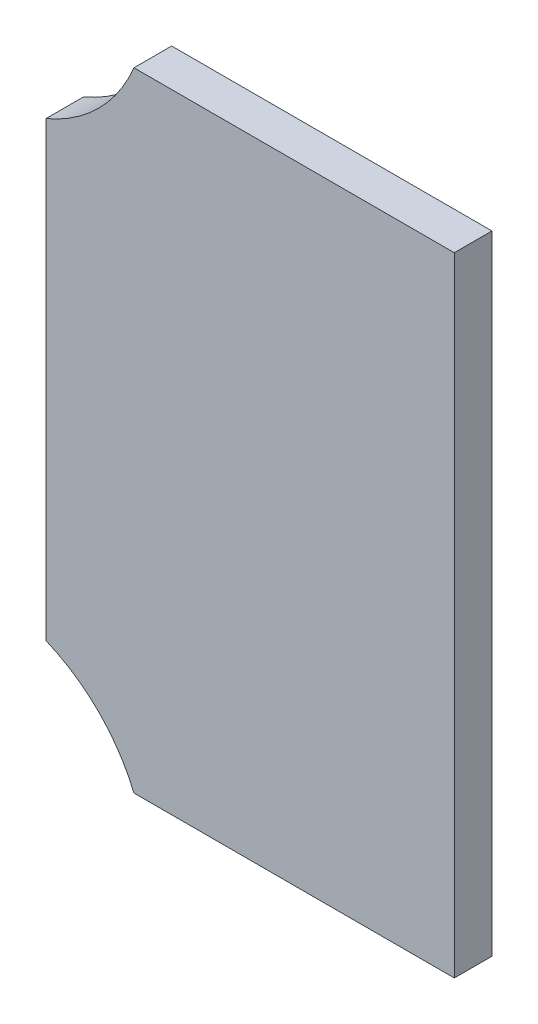
ISO-10303-21;
HEADER;
FILE_DESCRIPTION(('STEP AP214'),'2;1');
FILE_NAME('part.step','',(''),(''),'','','');
FILE_SCHEMA(('AUTOMOTIVE_DESIGN { 1 0 10303 214 1 1 1 1 }'));
ENDSEC;
DATA;
#1=APPLICATION_CONTEXT('core data for automotive mechanical design processes');
#2=APPLICATION_PROTOCOL_DEFINITION('international standard','automotive_design',2000,#1);
#3=PRODUCT_CONTEXT('',#1,'mechanical');
#4=PRODUCT('Part','Part','',(#3));
#5=PRODUCT_RELATED_PRODUCT_CATEGORY('part','',(#4));
#6=PRODUCT_DEFINITION_FORMATION('','',#4);
#7=PRODUCT_DEFINITION_CONTEXT('part definition',#1,'design');
#8=PRODUCT_DEFINITION('design','',#6,#7);
#9=PRODUCT_DEFINITION_SHAPE('','',#8);
#10=(LENGTH_UNIT() NAMED_UNIT(*) SI_UNIT(.MILLI.,.METRE.));
#11=(NAMED_UNIT(*) PLANE_ANGLE_UNIT() SI_UNIT($,.RADIAN.));
#12=(NAMED_UNIT(*) SI_UNIT($,.STERADIAN.) SOLID_ANGLE_UNIT());
#13=UNCERTAINTY_MEASURE_WITH_UNIT(LENGTH_MEASURE(1.E-05),#10,'distance_accuracy_value','');
#14=(GEOMETRIC_REPRESENTATION_CONTEXT(3) GLOBAL_UNCERTAINTY_ASSIGNED_CONTEXT((#13)) GLOBAL_UNIT_ASSIGNED_CONTEXT((#10,
#11,#12)) REPRESENTATION_CONTEXT('',''));
#15=CARTESIAN_POINT('',(0.,0.,0.));
#16=DIRECTION('',(0.,0.,1.));
#17=DIRECTION('',(1.,0.,0.));
#18=AXIS2_PLACEMENT_3D('',#15,#16,#17);
#19=CARTESIAN_POINT('',(-0.5,-0.25,0.));
#20=DIRECTION('',(0.,0.,1.));
#21=DIRECTION('',(1.,0.,0.));
#22=AXIS2_PLACEMENT_3D('',#19,#20,#21);
#23=PLANE('',#22);
#24=DIRECTION('',(0.,1.,0.));
#25=VECTOR('',#24,1.);
#26=CARTESIAN_POINT('',(-0.175,0.25,0.));
#27=LINE('',#26,#25);
#28=CARTESIAN_POINT('',(-0.175,-0.25,0.));
#29=VERTEX_POINT('',#28);
#30=CARTESIAN_POINT('',(-0.175,0.25,0.));
#31=VERTEX_POINT('',#30);
#32=EDGE_CURVE('E66',#29,#31,#27,.T.);
#33=ORIENTED_EDGE('',*,*,#32,.T.);
#34=DIRECTION('',(1.,0.,0.));
#35=VECTOR('',#34,1.);
#36=CARTESIAN_POINT('',(-0.43,0.25,0.));
#37=LINE('',#36,#35);
#38=CARTESIAN_POINT('',(-0.429999999996464,0.250000000008485,0.));
#39=VERTEX_POINT('',#38);
#40=EDGE_CURVE('E62',#31,#39,#37,.F.);
#41=ORIENTED_EDGE('',*,*,#40,.T.);
#42=CARTESIAN_POINT('',(-0.55,0.3,0.));
#43=DIRECTION('',(0.,0.,-1.));
#44=DIRECTION('',(-1.,0.,0.));
#45=AXIS2_PLACEMENT_3D('',#42,#43,#44);
#46=CIRCLE('',#45,0.13);
#47=CARTESIAN_POINT('',(-0.5,0.18,0.));
#48=VERTEX_POINT('',#47);
#49=EDGE_CURVE('E20',#39,#48,#46,.T.);
#50=ORIENTED_EDGE('',*,*,#49,.T.);
#51=DIRECTION('',(0.,1.,0.));
#52=VECTOR('',#51,1.);
#53=CARTESIAN_POINT('',(-0.5,-0.18,0.));
#54=LINE('',#53,#52);
#55=CARTESIAN_POINT('',(-0.5,-0.18,0.));
#56=VERTEX_POINT('',#55);
#57=EDGE_CURVE('E111',#48,#56,#54,.F.);
#58=ORIENTED_EDGE('',*,*,#57,.T.);
#59=CARTESIAN_POINT('',(-0.55,-0.3,0.));
#60=DIRECTION('',(0.,0.,-1.));
#61=DIRECTION('',(-1.,0.,0.));
#62=AXIS2_PLACEMENT_3D('',#59,#60,#61);
#63=CIRCLE('',#62,0.13);
#64=CARTESIAN_POINT('',(-0.429999999998535,-0.250000000003515,0.));
#65=VERTEX_POINT('',#64);
#66=EDGE_CURVE('E121',#56,#65,#63,.T.);
#67=ORIENTED_EDGE('',*,*,#66,.T.);
#68=DIRECTION('',(1.,0.,0.));
#69=VECTOR('',#68,1.);
#70=CARTESIAN_POINT('',(-0.43,-0.25,0.));
#71=LINE('',#70,#69);
#72=EDGE_CURVE('E107',#65,#29,#71,.T.);
#73=ORIENTED_EDGE('',*,*,#72,.T.);
#74=EDGE_LOOP('',(#33,#41,#50,#58,#67,#73));
#75=FACE_BOUND('',#74,.T.);
#76=ADVANCED_FACE('F17',(#75),#23,.T.);
#77=CARTESIAN_POINT('',(-0.43,-0.25,-0.03));
#78=DIRECTION('',(0.,1.,0.));
#79=DIRECTION('',(0.,0.,1.));
#80=AXIS2_PLACEMENT_3D('',#77,#78,#79);
#81=PLANE('',#80);
#82=DIRECTION('',(1.,0.,0.));
#83=VECTOR('',#82,1.);
#84=CARTESIAN_POINT('',(-0.5,-0.250000000007,-0.03));
#85=LINE('',#84,#83);
#86=CARTESIAN_POINT('',(-0.429999999997077,-0.250000000007015,-0.03));
#87=VERTEX_POINT('',#86);
#88=CARTESIAN_POINT('',(-0.175,-0.250000000004667,-0.03));
#89=VERTEX_POINT('',#88);
#90=EDGE_CURVE('E95',#87,#89,#85,.T.);
#91=ORIENTED_EDGE('',*,*,#90,.T.);
#92=DIRECTION('',(0.,0.,1.));
#93=VECTOR('',#92,1.);
#94=CARTESIAN_POINT('',(-0.175,-0.25,-0.03));
#95=LINE('',#94,#93);
#96=EDGE_CURVE('E81',#89,#29,#95,.T.);
#97=ORIENTED_EDGE('',*,*,#96,.T.);
#98=ORIENTED_EDGE('',*,*,#72,.F.);
#99=DIRECTION('',(0.,0.,-1.));
#100=VECTOR('',#99,1.);
#101=CARTESIAN_POINT('',(-0.429999999997071,-0.25000000000703,0.));
#102=LINE('',#101,#100);
#103=EDGE_CURVE('E97',#65,#87,#102,.T.);
#104=ORIENTED_EDGE('',*,*,#103,.T.);
#105=EDGE_LOOP('',(#91,#97,#98,#104));
#106=FACE_BOUND('',#105,.T.);
#107=ADVANCED_FACE('F156',(#106),#81,.F.);
#108=CARTESIAN_POINT('',(-0.175,0.25,-0.03));
#109=DIRECTION('',(-1.,0.,0.));
#110=DIRECTION('',(0.,0.,1.));
#111=AXIS2_PLACEMENT_3D('',#108,#109,#110);
#112=PLANE('',#111);
#113=DIRECTION('',(0.,1.,0.));
#114=VECTOR('',#113,1.);
#115=CARTESIAN_POINT('',(-0.175,-0.25,-0.03));
#116=LINE('',#115,#114);
#117=CARTESIAN_POINT('',(-0.175,0.25,-0.03));
#118=VERTEX_POINT('',#117);
#119=EDGE_CURVE('E88',#89,#118,#116,.T.);
#120=ORIENTED_EDGE('',*,*,#119,.T.);
#121=DIRECTION('',(0.,0.,-1.));
#122=VECTOR('',#121,1.);
#123=CARTESIAN_POINT('',(-0.175,0.25,-0.03));
#124=LINE('',#123,#122);
#125=EDGE_CURVE('E74',#118,#31,#124,.F.);
#126=ORIENTED_EDGE('',*,*,#125,.T.);
#127=ORIENTED_EDGE('',*,*,#32,.F.);
#128=ORIENTED_EDGE('',*,*,#96,.F.);
#129=EDGE_LOOP('',(#120,#126,#127,#128));
#130=FACE_BOUND('',#129,.T.);
#131=ADVANCED_FACE('F93',(#130),#112,.F.);
#132=CARTESIAN_POINT('',(-0.43,0.25,-0.03));
#133=DIRECTION('',(0.,-1.,0.));
#134=DIRECTION('',(0.,0.,-1.));
#135=AXIS2_PLACEMENT_3D('',#132,#133,#134);
#136=PLANE('',#135);
#137=ORIENTED_EDGE('',*,*,#40,.F.);
#138=ORIENTED_EDGE('',*,*,#125,.F.);
#139=DIRECTION('',(1.,0.,0.));
#140=VECTOR('',#139,1.);
#141=CARTESIAN_POINT('',(-0.5,0.25,-0.03));
#142=LINE('',#141,#140);
#143=CARTESIAN_POINT('',(-0.429999999996464,0.250000000008485,-0.03));
#144=VERTEX_POINT('',#143);
#145=EDGE_CURVE('E78',#118,#144,#142,.F.);
#146=ORIENTED_EDGE('',*,*,#145,.T.);
#147=DIRECTION('',(0.,0.,-1.));
#148=VECTOR('',#147,1.);
#149=CARTESIAN_POINT('',(-0.429999999992929,0.25000000001697,0.));
#150=LINE('',#149,#148);
#151=EDGE_CURVE('E115',#144,#39,#150,.F.);
#152=ORIENTED_EDGE('',*,*,#151,.T.);
#153=EDGE_LOOP('',(#137,#138,#146,#152));
#154=FACE_BOUND('',#153,.T.);
#155=ADVANCED_FACE('F76',(#154),#136,.F.);
#156=CARTESIAN_POINT('',(-0.55,0.3,0.));
#157=DIRECTION('',(0.,0.,-1.));
#158=DIRECTION('',(-1.,0.,0.));
#159=AXIS2_PLACEMENT_3D('',#156,#157,#158);
#160=CYLINDRICAL_SURFACE('',#159,0.13);
#161=DIRECTION('',(0.,0.,-1.));
#162=VECTOR('',#161,1.);
#163=CARTESIAN_POINT('',(-0.5,0.18,0.));
#164=LINE('',#163,#162);
#165=CARTESIAN_POINT('',(-0.5,0.18,-0.03));
#166=VERTEX_POINT('',#165);
#167=EDGE_CURVE('E113',#166,#48,#164,.F.);
#168=ORIENTED_EDGE('',*,*,#167,.T.);
#169=ORIENTED_EDGE('',*,*,#49,.F.);
#170=ORIENTED_EDGE('',*,*,#151,.F.);
#171=CARTESIAN_POINT('',(-0.55,0.3,-0.03));
#172=DIRECTION('',(0.,0.,-1.));
#173=DIRECTION('',(-1.,0.,0.));
#174=AXIS2_PLACEMENT_3D('',#171,#172,#173);
#175=CIRCLE('',#174,0.13);
#176=EDGE_CURVE('E91',#144,#166,#175,.T.);
#177=ORIENTED_EDGE('',*,*,#176,.T.);
#178=EDGE_LOOP('',(#168,#169,#170,#177));
#179=FACE_BOUND('',#178,.T.);
#180=ADVANCED_FACE('F135',(#179),#160,.F.);
#181=CARTESIAN_POINT('',(-0.5,-0.18,0.));
#182=DIRECTION('',(1.,0.,0.));
#183=DIRECTION('',(0.,0.,-1.));
#184=AXIS2_PLACEMENT_3D('',#181,#182,#183);
#185=PLANE('',#184);
#186=ORIENTED_EDGE('',*,*,#57,.F.);
#187=ORIENTED_EDGE('',*,*,#167,.F.);
#188=DIRECTION('',(0.,1.,0.));
#189=VECTOR('',#188,1.);
#190=CARTESIAN_POINT('',(-0.5,-0.25,-0.03));
#191=LINE('',#190,#189);
#192=CARTESIAN_POINT('',(-0.5,-0.18,-0.03));
#193=VERTEX_POINT('',#192);
#194=EDGE_CURVE('E26',#166,#193,#191,.F.);
#195=ORIENTED_EDGE('',*,*,#194,.T.);
#196=DIRECTION('',(0.,0.,-1.));
#197=VECTOR('',#196,1.);
#198=CARTESIAN_POINT('',(-0.5,-0.18,0.));
#199=LINE('',#198,#197);
#200=EDGE_CURVE('E34',#193,#56,#199,.F.);
#201=ORIENTED_EDGE('',*,*,#200,.T.);
#202=EDGE_LOOP('',(#186,#187,#195,#201));
#203=FACE_BOUND('',#202,.T.);
#204=ADVANCED_FACE('F134',(#203),#185,.F.);
#205=CARTESIAN_POINT('',(-0.55,-0.3,0.));
#206=DIRECTION('',(0.,0.,-1.));
#207=DIRECTION('',(-1.,0.,0.));
#208=AXIS2_PLACEMENT_3D('',#205,#206,#207);
#209=CYLINDRICAL_SURFACE('',#208,0.13);
#210=ORIENTED_EDGE('',*,*,#103,.F.);
#211=ORIENTED_EDGE('',*,*,#66,.F.);
#212=ORIENTED_EDGE('',*,*,#200,.F.);
#213=CARTESIAN_POINT('',(-0.55,-0.3,-0.03));
#214=DIRECTION('',(0.,0.,-1.));
#215=DIRECTION('',(-1.,0.,0.));
#216=AXIS2_PLACEMENT_3D('',#213,#214,#215);
#217=CIRCLE('',#216,0.13);
#218=EDGE_CURVE('E11',#193,#87,#217,.T.);
#219=ORIENTED_EDGE('',*,*,#218,.T.);
#220=EDGE_LOOP('',(#210,#211,#212,#219));
#221=FACE_BOUND('',#220,.T.);
#222=ADVANCED_FACE('F143',(#221),#209,.F.);
#223=CARTESIAN_POINT('',(-0.5,-0.25,-0.03));
#224=DIRECTION('',(0.,0.,1.));
#225=DIRECTION('',(1.,0.,0.));
#226=AXIS2_PLACEMENT_3D('',#223,#224,#225);
#227=PLANE('',#226);
#228=ORIENTED_EDGE('',*,*,#194,.F.);
#229=ORIENTED_EDGE('',*,*,#176,.F.);
#230=ORIENTED_EDGE('',*,*,#145,.F.);
#231=ORIENTED_EDGE('',*,*,#119,.F.);
#232=ORIENTED_EDGE('',*,*,#90,.F.);
#233=ORIENTED_EDGE('',*,*,#218,.F.);
#234=EDGE_LOOP('',(#228,#229,#230,#231,#232,#233));
#235=FACE_BOUND('',#234,.T.);
#236=ADVANCED_FACE('F87',(#235),#227,.F.);
#237=CLOSED_SHELL('',(#76,#107,#131,#155,#180,#204,#222,#236));
#238=MANIFOLD_SOLID_BREP('B1',#237);
#239=ADVANCED_BREP_SHAPE_REPRESENTATION('',(#18,#238),#14);
#240=SHAPE_DEFINITION_REPRESENTATION(#9,#239);
ENDSEC;
END-ISO-10303-21;
